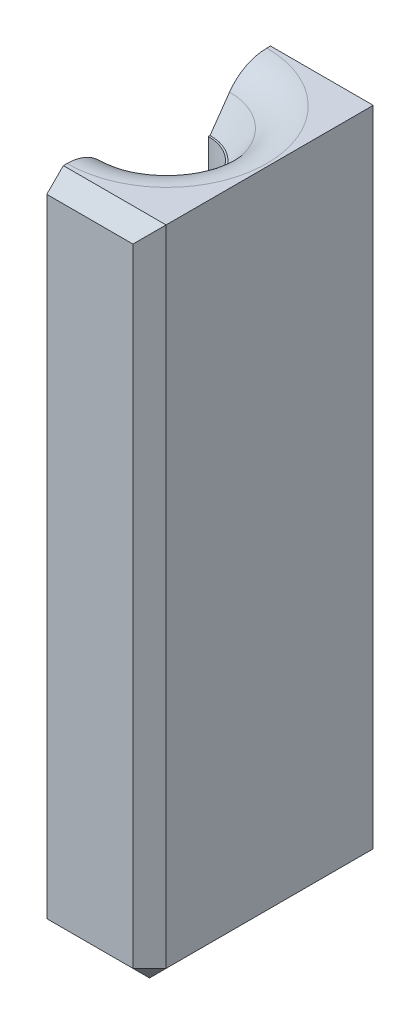
ISO-10303-21;
HEADER;
FILE_DESCRIPTION(('STEP AP214'),'2;1');
FILE_NAME('part.step','',(''),(''),'','','');
FILE_SCHEMA(('AUTOMOTIVE_DESIGN { 1 0 10303 214 1 1 1 1 }'));
ENDSEC;
DATA;
#1=APPLICATION_CONTEXT('core data for automotive mechanical design processes');
#2=APPLICATION_PROTOCOL_DEFINITION('international standard','automotive_design',2000,#1);
#3=PRODUCT_CONTEXT('',#1,'mechanical');
#4=PRODUCT('Part','Part','',(#3));
#5=PRODUCT_RELATED_PRODUCT_CATEGORY('part','',(#4));
#6=PRODUCT_DEFINITION_FORMATION('','',#4);
#7=PRODUCT_DEFINITION_CONTEXT('part definition',#1,'design');
#8=PRODUCT_DEFINITION('design','',#6,#7);
#9=PRODUCT_DEFINITION_SHAPE('','',#8);
#10=(LENGTH_UNIT() NAMED_UNIT(*) SI_UNIT(.MILLI.,.METRE.));
#11=(NAMED_UNIT(*) PLANE_ANGLE_UNIT() SI_UNIT($,.RADIAN.));
#12=(NAMED_UNIT(*) SI_UNIT($,.STERADIAN.) SOLID_ANGLE_UNIT());
#13=UNCERTAINTY_MEASURE_WITH_UNIT(LENGTH_MEASURE(1.E-05),#10,'distance_accuracy_value','');
#14=(GEOMETRIC_REPRESENTATION_CONTEXT(3) GLOBAL_UNCERTAINTY_ASSIGNED_CONTEXT((#13)) GLOBAL_UNIT_ASSIGNED_CONTEXT((#10,
#11,#12)) REPRESENTATION_CONTEXT('',''));
#15=CARTESIAN_POINT('',(0.,0.,0.));
#16=DIRECTION('',(0.,0.,1.));
#17=DIRECTION('',(1.,0.,0.));
#18=AXIS2_PLACEMENT_3D('',#15,#16,#17);
#19=CARTESIAN_POINT('',(30.,0.,0.));
#20=DIRECTION('',(-1.,0.,0.));
#21=DIRECTION('',(0.,0.,1.));
#22=AXIS2_PLACEMENT_3D('',#19,#20,#21);
#23=PLANE('',#22);
#24=CARTESIAN_POINT('',(30.,18.,-4.));
#25=DIRECTION('',(-1.,0.,0.));
#26=DIRECTION('',(0.,0.,1.));
#27=AXIS2_PLACEMENT_3D('',#24,#25,#26);
#28=CIRCLE('',#27,2.575);
#29=CARTESIAN_POINT('',(30.,18.,-1.425));
#30=VERTEX_POINT('',#29);
#31=EDGE_CURVE('E329',#30,#30,#28,.T.);
#32=ORIENTED_EDGE('',*,*,#31,.F.);
#33=EDGE_LOOP('',(#32));
#34=FACE_BOUND('',#33,.T.);
#35=CARTESIAN_POINT('',(30.,18.,-26.));
#36=DIRECTION('',(-1.,0.,0.));
#37=DIRECTION('',(0.,0.,1.));
#38=AXIS2_PLACEMENT_3D('',#35,#36,#37);
#39=CIRCLE('',#38,2.575);
#40=CARTESIAN_POINT('',(30.,18.,-23.425));
#41=VERTEX_POINT('',#40);
#42=EDGE_CURVE('E338',#41,#41,#39,.T.);
#43=ORIENTED_EDGE('',*,*,#42,.F.);
#44=EDGE_LOOP('',(#43));
#45=FACE_BOUND('',#44,.T.);
#46=CARTESIAN_POINT('',(30.,64.5,-26.));
#47=DIRECTION('',(-1.,0.,0.));
#48=DIRECTION('',(0.,0.,1.));
#49=AXIS2_PLACEMENT_3D('',#46,#47,#48);
#50=CIRCLE('',#49,2.575);
#51=CARTESIAN_POINT('',(30.,64.5,-23.425));
#52=VERTEX_POINT('',#51);
#53=EDGE_CURVE('E556',#52,#52,#50,.T.);
#54=ORIENTED_EDGE('',*,*,#53,.F.);
#55=EDGE_LOOP('',(#54));
#56=FACE_BOUND('',#55,.T.);
#57=CARTESIAN_POINT('',(30.,64.5,-4.));
#58=DIRECTION('',(-1.,0.,0.));
#59=DIRECTION('',(0.,0.,1.));
#60=AXIS2_PLACEMENT_3D('',#57,#58,#59);
#61=CIRCLE('',#60,2.575);
#62=CARTESIAN_POINT('',(30.,64.5,-1.42500000000001));
#63=VERTEX_POINT('',#62);
#64=EDGE_CURVE('E344',#63,#63,#61,.T.);
#65=ORIENTED_EDGE('',*,*,#64,.F.);
#66=EDGE_LOOP('',(#65));
#67=FACE_BOUND('',#66,.T.);
#68=DIRECTION('',(0.,1.,0.));
#69=VECTOR('',#68,1.);
#70=CARTESIAN_POINT('',(30.,0.,-0.5));
#71=LINE('',#70,#69);
#72=CARTESIAN_POINT('',(30.,6.28575422534895,-0.5));
#73=VERTEX_POINT('',#72);
#74=CARTESIAN_POINT('',(30.,82.,-0.5));
#75=VERTEX_POINT('',#74);
#76=EDGE_CURVE('E236',#73,#75,#71,.T.);
#77=ORIENTED_EDGE('',*,*,#76,.T.);
#78=DIRECTION('',(0.,0.707106781186546,-0.707106781186549));
#79=VECTOR('',#78,1.);
#80=CARTESIAN_POINT('',(30.,40.7500000000001,40.75));
#81=LINE('',#80,#79);
#82=CARTESIAN_POINT('',(30.,84.,-2.50000000000001));
#83=VERTEX_POINT('',#82);
#84=EDGE_CURVE('E286',#75,#83,#81,.T.);
#85=ORIENTED_EDGE('',*,*,#84,.T.);
#86=DIRECTION('',(0.,0.,-1.));
#87=VECTOR('',#86,1.);
#88=CARTESIAN_POINT('',(30.,84.,0.));
#89=LINE('',#88,#87);
#90=CARTESIAN_POINT('',(29.9999999999994,84.,-2.93688122196542));
#91=VERTEX_POINT('',#90);
#92=EDGE_CURVE('E380',#83,#91,#89,.T.);
#93=ORIENTED_EDGE('',*,*,#92,.T.);
#94=CARTESIAN_POINT('',(29.9999999999994,78.5,-2.93688122196542));
#95=DIRECTION('',(-1.,0.,0.));
#96=DIRECTION('',(0.,0.,1.));
#97=AXIS2_PLACEMENT_3D('',#94,#95,#96);
#98=CIRCLE('',#97,5.5);
#99=CARTESIAN_POINT('',(29.9999999999994,81.6546703999308,-7.44221746555486));
#100=VERTEX_POINT('',#99);
#101=EDGE_CURVE('E357',#100,#91,#98,.F.);
#102=ORIENTED_EDGE('',*,*,#101,.F.);
#103=DIRECTION('',(0.,0.819152044288991,0.573576436351047));
#104=VECTOR('',#103,1.);
#105=CARTESIAN_POINT('',(30.,70.8610383379726,-15.));
#106=LINE('',#105,#104);
#107=CARTESIAN_POINT('',(29.9999999999994,78.3,-9.79118296779536));
#108=VERTEX_POINT('',#107);
#109=EDGE_CURVE('E234',#100,#108,#106,.F.);
#110=ORIENTED_EDGE('',*,*,#109,.T.);
#111=DIRECTION('',(0.,0.,1.));
#112=VECTOR('',#111,1.);
#113=CARTESIAN_POINT('',(29.9999999999994,78.3,-15.));
#114=LINE('',#113,#112);
#115=CARTESIAN_POINT('',(29.9999999999994,78.3,-10.));
#116=VERTEX_POINT('',#115);
#117=EDGE_CURVE('E362',#116,#108,#114,.T.);
#118=ORIENTED_EDGE('',*,*,#117,.F.);
#119=DIRECTION('',(0.,1.,0.));
#120=VECTOR('',#119,1.);
#121=CARTESIAN_POINT('',(30.,0.,-10.));
#122=LINE('',#121,#120);
#123=CARTESIAN_POINT('',(30.,72.8279687630189,-10.));
#124=VERTEX_POINT('',#123);
#125=EDGE_CURVE('E368',#116,#124,#122,.F.);
#126=ORIENTED_EDGE('',*,*,#125,.T.);
#127=DIRECTION('',(0.,0.969140628666556,-0.246508502627785));
#128=VECTOR('',#127,1.);
#129=CARTESIAN_POINT('',(30.,92.4853156361592,-15.));
#130=LINE('',#129,#128);
#131=CARTESIAN_POINT('',(30.,57.5499259961936,-6.11391026840425));
#132=VERTEX_POINT('',#131);
#133=EDGE_CURVE('E413',#124,#132,#130,.F.);
#134=ORIENTED_EDGE('',*,*,#133,.T.);
#135=DIRECTION('',(0.,0.811788056770281,0.583952182019325));
#136=VECTOR('',#135,1.);
#137=CARTESIAN_POINT('',(30.,45.1968228867001,-15.));
#138=LINE('',#137,#136);
#139=CARTESIAN_POINT('',(30.,53.4020041055008,-9.09767926908721));
#140=VERTEX_POINT('',#139);
#141=EDGE_CURVE('E416',#132,#140,#138,.F.);
#142=ORIENTED_EDGE('',*,*,#141,.T.);
#143=DIRECTION('',(0.,0.,-1.));
#144=VECTOR('',#143,1.);
#145=CARTESIAN_POINT('',(30.,53.4020041055008,-24.9411461228427));
#146=LINE('',#145,#144);
#147=CARTESIAN_POINT('',(30.,53.4020041055008,-10.));
#148=VERTEX_POINT('',#147);
#149=EDGE_CURVE('E406',#140,#148,#146,.T.);
#150=ORIENTED_EDGE('',*,*,#149,.T.);
#151=DIRECTION('',(0.,1.,0.));
#152=VECTOR('',#151,1.);
#153=CARTESIAN_POINT('',(30.,0.,-10.));
#154=LINE('',#153,#152);
#155=CARTESIAN_POINT('',(30.,34.4020041055008,-10.));
#156=VERTEX_POINT('',#155);
#157=EDGE_CURVE('E400',#148,#156,#154,.F.);
#158=ORIENTED_EDGE('',*,*,#157,.T.);
#159=DIRECTION('',(0.,0.,1.));
#160=VECTOR('',#159,1.);
#161=CARTESIAN_POINT('',(30.,34.4020041055008,-24.9411461228427));
#162=LINE('',#161,#160);
#163=CARTESIAN_POINT('',(30.,34.4020041055008,-9.09767926908721));
#164=VERTEX_POINT('',#163);
#165=EDGE_CURVE('E385',#156,#164,#162,.T.);
#166=ORIENTED_EDGE('',*,*,#165,.T.);
#167=DIRECTION('',(0.,0.811788056770281,-0.583952182019325));
#168=VECTOR('',#167,1.);
#169=CARTESIAN_POINT('',(30.,42.6071853243014,-15.));
#170=LINE('',#169,#168);
#171=CARTESIAN_POINT('',(30.,30.2540822148079,-6.11391026840424));
#172=VERTEX_POINT('',#171);
#173=EDGE_CURVE('E391',#164,#172,#170,.F.);
#174=ORIENTED_EDGE('',*,*,#173,.T.);
#175=DIRECTION('',(0.,0.969140628666556,0.246508502627785));
#176=VECTOR('',#175,1.);
#177=CARTESIAN_POINT('',(30.,-4.6813074251577,-15.));
#178=LINE('',#177,#176);
#179=CARTESIAN_POINT('',(30.,14.9760394479826,-10.));
#180=VERTEX_POINT('',#179);
#181=EDGE_CURVE('E394',#172,#180,#178,.F.);
#182=ORIENTED_EDGE('',*,*,#181,.T.);
#183=DIRECTION('',(0.,1.,0.));
#184=VECTOR('',#183,1.);
#185=CARTESIAN_POINT('',(30.,0.,-10.));
#186=LINE('',#185,#184);
#187=CARTESIAN_POINT('',(30.,11.,-10.));
#188=VERTEX_POINT('',#187);
#189=EDGE_CURVE('E227',#180,#188,#186,.F.);
#190=ORIENTED_EDGE('',*,*,#189,.T.);
#191=DIRECTION('',(0.,0.,-1.));
#192=VECTOR('',#191,1.);
#193=CARTESIAN_POINT('',(30.,11.,-15.));
#194=LINE('',#193,#192);
#195=CARTESIAN_POINT('',(30.,11.,-11.45));
#196=VERTEX_POINT('',#195);
#197=EDGE_CURVE('E422',#188,#196,#194,.T.);
#198=ORIENTED_EDGE('',*,*,#197,.T.);
#199=DIRECTION('',(0.,0.707106781186544,0.707106781186551));
#200=VECTOR('',#199,1.);
#201=CARTESIAN_POINT('',(30.,7.45000000000003,-15.));
#202=LINE('',#201,#200);
#203=CARTESIAN_POINT('',(30.,10.6,-11.85));
#204=VERTEX_POINT('',#203);
#205=EDGE_CURVE('E226',#204,#196,#202,.T.);
#206=ORIENTED_EDGE('',*,*,#205,.F.);
#207=DIRECTION('',(0.,-1.,0.));
#208=VECTOR('',#207,1.);
#209=CARTESIAN_POINT('',(30.,11.,-11.85));
#210=LINE('',#209,#208);
#211=CARTESIAN_POINT('',(30.,6.28575422534894,-11.85));
#212=VERTEX_POINT('',#211);
#213=EDGE_CURVE('E212',#204,#212,#210,.T.);
#214=ORIENTED_EDGE('',*,*,#213,.T.);
#215=DIRECTION('',(0.,0.,-1.));
#216=VECTOR('',#215,1.);
#217=CARTESIAN_POINT('',(30.,6.28575422534894,0.));
#218=LINE('',#217,#216);
#219=CARTESIAN_POINT('',(30.,6.28575422534894,-18.15));
#220=VERTEX_POINT('',#219);
#221=EDGE_CURVE('E224',#212,#220,#218,.T.);
#222=ORIENTED_EDGE('',*,*,#221,.T.);
#223=DIRECTION('',(0.,-1.,0.));
#224=VECTOR('',#223,1.);
#225=CARTESIAN_POINT('',(30.,11.,-18.15));
#226=LINE('',#225,#224);
#227=CARTESIAN_POINT('',(30.,10.6,-18.15));
#228=VERTEX_POINT('',#227);
#229=EDGE_CURVE('E215',#220,#228,#226,.F.);
#230=ORIENTED_EDGE('',*,*,#229,.T.);
#231=DIRECTION('',(0.,-0.707106781186544,0.707106781186551));
#232=VECTOR('',#231,1.);
#233=CARTESIAN_POINT('',(30.,7.45000000000003,-15.));
#234=LINE('',#233,#232);
#235=CARTESIAN_POINT('',(30.,11.,-18.55));
#236=VERTEX_POINT('',#235);
#237=EDGE_CURVE('E365',#236,#228,#234,.T.);
#238=ORIENTED_EDGE('',*,*,#237,.F.);
#239=CARTESIAN_POINT('',(30.,11.,-20.));
#240=VERTEX_POINT('',#239);
#241=EDGE_CURVE('E423',#236,#240,#194,.T.);
#242=ORIENTED_EDGE('',*,*,#241,.T.);
#243=DIRECTION('',(0.,1.,0.));
#244=VECTOR('',#243,1.);
#245=CARTESIAN_POINT('',(30.,0.,-20.));
#246=LINE('',#245,#244);
#247=CARTESIAN_POINT('',(30.,14.9760394479826,-20.));
#248=VERTEX_POINT('',#247);
#249=EDGE_CURVE('E377',#240,#248,#246,.T.);
#250=ORIENTED_EDGE('',*,*,#249,.T.);
#251=DIRECTION('',(0.,-0.969140628666556,0.246508502627785));
#252=VECTOR('',#251,1.);
#253=CARTESIAN_POINT('',(30.,-4.6813074251577,-15.));
#254=LINE('',#253,#252);
#255=CARTESIAN_POINT('',(30.,30.2540822148079,-23.8860897315958));
#256=VERTEX_POINT('',#255);
#257=EDGE_CURVE('E397',#248,#256,#254,.F.);
#258=ORIENTED_EDGE('',*,*,#257,.T.);
#259=DIRECTION('',(0.,-0.811788056770281,-0.583952182019325));
#260=VECTOR('',#259,1.);
#261=CARTESIAN_POINT('',(30.,42.6071853243014,-15.));
#262=LINE('',#261,#260);
#263=CARTESIAN_POINT('',(30.,34.4020041055008,-20.9023207309128));
#264=VERTEX_POINT('',#263);
#265=EDGE_CURVE('E388',#256,#264,#262,.F.);
#266=ORIENTED_EDGE('',*,*,#265,.T.);
#267=CARTESIAN_POINT('',(30.,34.4020041055008,-20.));
#268=VERTEX_POINT('',#267);
#269=EDGE_CURVE('E384',#264,#268,#162,.T.);
#270=ORIENTED_EDGE('',*,*,#269,.T.);
#271=DIRECTION('',(0.,1.,0.));
#272=VECTOR('',#271,1.);
#273=CARTESIAN_POINT('',(30.,0.,-20.));
#274=LINE('',#273,#272);
#275=CARTESIAN_POINT('',(30.,53.4020041055008,-20.));
#276=VERTEX_POINT('',#275);
#277=EDGE_CURVE('E403',#268,#276,#274,.T.);
#278=ORIENTED_EDGE('',*,*,#277,.T.);
#279=CARTESIAN_POINT('',(30.,53.4020041055008,-20.9023207309128));
#280=VERTEX_POINT('',#279);
#281=EDGE_CURVE('E407',#276,#280,#146,.T.);
#282=ORIENTED_EDGE('',*,*,#281,.T.);
#283=DIRECTION('',(0.,-0.811788056770281,0.583952182019325));
#284=VECTOR('',#283,1.);
#285=CARTESIAN_POINT('',(30.,45.1968228867001,-15.));
#286=LINE('',#285,#284);
#287=CARTESIAN_POINT('',(30.,57.5499259961936,-23.8860897315957));
#288=VERTEX_POINT('',#287);
#289=EDGE_CURVE('E419',#280,#288,#286,.F.);
#290=ORIENTED_EDGE('',*,*,#289,.T.);
#291=DIRECTION('',(0.,-0.969140628666556,-0.246508502627785));
#292=VECTOR('',#291,1.);
#293=CARTESIAN_POINT('',(30.,92.4853156361592,-15.));
#294=LINE('',#293,#292);
#295=CARTESIAN_POINT('',(30.,72.8279687630189,-20.));
#296=VERTEX_POINT('',#295);
#297=EDGE_CURVE('E410',#288,#296,#294,.F.);
#298=ORIENTED_EDGE('',*,*,#297,.T.);
#299=DIRECTION('',(0.,1.,0.));
#300=VECTOR('',#299,1.);
#301=CARTESIAN_POINT('',(30.,0.,-20.));
#302=LINE('',#301,#300);
#303=CARTESIAN_POINT('',(29.9999999999994,78.3,-20.));
#304=VERTEX_POINT('',#303);
#305=EDGE_CURVE('E371',#296,#304,#302,.T.);
#306=ORIENTED_EDGE('',*,*,#305,.T.);
#307=CARTESIAN_POINT('',(30.,78.3,-20.2088170322047));
#308=VERTEX_POINT('',#307);
#309=EDGE_CURVE('E363',#308,#304,#114,.T.);
#310=ORIENTED_EDGE('',*,*,#309,.F.);
#311=DIRECTION('',(0.,-0.819152044288991,0.573576436351047));
#312=VECTOR('',#311,1.);
#313=CARTESIAN_POINT('',(30.,70.8610383379726,-15.));
#314=LINE('',#313,#312);
#315=CARTESIAN_POINT('',(29.9999999999994,81.6546703999308,-22.5577825344452));
#316=VERTEX_POINT('',#315);
#317=EDGE_CURVE('E230',#308,#316,#314,.F.);
#318=ORIENTED_EDGE('',*,*,#317,.T.);
#319=CARTESIAN_POINT('',(29.9999999999994,78.5,-27.0631187780346));
#320=DIRECTION('',(-1.,0.,0.));
#321=DIRECTION('',(0.,0.,1.));
#322=AXIS2_PLACEMENT_3D('',#319,#320,#321);
#323=CIRCLE('',#322,5.5);
#324=CARTESIAN_POINT('',(29.9999999999994,84.,-27.0631187780346));
#325=VERTEX_POINT('',#324);
#326=EDGE_CURVE('E360',#325,#316,#323,.F.);
#327=ORIENTED_EDGE('',*,*,#326,.F.);
#328=CARTESIAN_POINT('',(30.,84.,-27.5));
#329=VERTEX_POINT('',#328);
#330=EDGE_CURVE('E381',#325,#329,#89,.T.);
#331=ORIENTED_EDGE('',*,*,#330,.T.);
#332=DIRECTION('',(0.,0.707106781186546,0.707106781186549));
#333=VECTOR('',#332,1.);
#334=CARTESIAN_POINT('',(30.,55.7500000000001,-55.75));
#335=LINE('',#334,#333);
#336=CARTESIAN_POINT('',(30.,82.,-29.5));
#337=VERTEX_POINT('',#336);
#338=EDGE_CURVE('E280',#329,#337,#335,.F.);
#339=ORIENTED_EDGE('',*,*,#338,.T.);
#340=DIRECTION('',(0.,1.,0.));
#341=VECTOR('',#340,1.);
#342=CARTESIAN_POINT('',(30.,0.,-29.5));
#343=LINE('',#342,#341);
#344=CARTESIAN_POINT('',(30.,6.28575422534894,-29.5));
#345=VERTEX_POINT('',#344);
#346=EDGE_CURVE('E231',#345,#337,#343,.T.);
#347=ORIENTED_EDGE('',*,*,#346,.F.);
#348=DIRECTION('',(0.,-0.707106781186546,0.707106781186549));
#349=VECTOR('',#348,1.);
#350=CARTESIAN_POINT('',(30.,-11.6071228873255,-11.6071228873255));
#351=LINE('',#350,#349);
#352=CARTESIAN_POINT('',(30.,4.28575422534894,-27.5));
#353=VERTEX_POINT('',#352);
#354=EDGE_CURVE('E282',#345,#353,#351,.T.);
#355=ORIENTED_EDGE('',*,*,#354,.T.);
#356=DIRECTION('',(0.,0.,-1.));
#357=VECTOR('',#356,1.);
#358=CARTESIAN_POINT('',(30.,4.28575422534894,0.));
#359=LINE('',#358,#357);
#360=CARTESIAN_POINT('',(30.,4.28575422534894,-2.5));
#361=VERTEX_POINT('',#360);
#362=EDGE_CURVE('E244',#361,#353,#359,.T.);
#363=ORIENTED_EDGE('',*,*,#362,.F.);
#364=DIRECTION('',(0.,-0.707106781186549,-0.707106781186546));
#365=VECTOR('',#364,1.);
#366=CARTESIAN_POINT('',(30.,3.39287711267446,-3.39287711267447));
#367=LINE('',#366,#365);
#368=EDGE_CURVE('E284',#361,#73,#367,.F.);
#369=ORIENTED_EDGE('',*,*,#368,.T.);
#370=EDGE_LOOP('',(#77,#85,#93,#102,#110,#118,#126,#134,#142,#150,#158,#166,#174,#182,#190,#198,
#206,#214,#222,#230,#238,#242,#250,#258,#266,#270,#278,#282,#290,#298,#306,#310,#318,#327,#331,
#339,#347,#355,#363,#369));
#371=FACE_BOUND('',#370,.T.);
#372=ADVANCED_FACE('F40',(#34,#45,#56,#67,#371),#23,.T.);
#373=CARTESIAN_POINT('',(15.,4.28575422534894,0.));
#374=DIRECTION('',(0.,-1.,0.));
#375=DIRECTION('',(0.,0.,-1.));
#376=AXIS2_PLACEMENT_3D('',#373,#374,#375);
#377=PLANE('',#376);
#378=DIRECTION('',(0.,0.,1.));
#379=VECTOR('',#378,1.);
#380=CARTESIAN_POINT('',(40.4,4.28575422534894,-0.5));
#381=LINE('',#380,#379);
#382=CARTESIAN_POINT('',(40.4,4.28575422534894,-27.5));
#383=VERTEX_POINT('',#382);
#384=CARTESIAN_POINT('',(40.4,4.28575422534894,-2.5));
#385=VERTEX_POINT('',#384);
#386=EDGE_CURVE('E300',#383,#385,#381,.T.);
#387=ORIENTED_EDGE('',*,*,#386,.T.);
#388=DIRECTION('',(-1.,0.,0.));
#389=VECTOR('',#388,1.);
#390=CARTESIAN_POINT('',(15.,4.28575422534894,-2.5));
#391=LINE('',#390,#389);
#392=EDGE_CURVE('E302',#385,#361,#391,.T.);
#393=ORIENTED_EDGE('',*,*,#392,.T.);
#394=ORIENTED_EDGE('',*,*,#362,.T.);
#395=DIRECTION('',(1.,0.,0.));
#396=VECTOR('',#395,1.);
#397=CARTESIAN_POINT('',(42.4,4.28575422534894,-27.5));
#398=LINE('',#397,#396);
#399=EDGE_CURVE('E298',#353,#383,#398,.T.);
#400=ORIENTED_EDGE('',*,*,#399,.T.);
#401=EDGE_LOOP('',(#387,#393,#394,#400));
#402=FACE_BOUND('',#401,.T.);
#403=ADVANCED_FACE('F499',(#402),#377,.T.);
#404=CARTESIAN_POINT('',(30.,34.4020041055008,-24.9411461228427));
#405=DIRECTION('',(0.,1.,0.));
#406=DIRECTION('',(0.,0.,-1.));
#407=AXIS2_PLACEMENT_3D('',#404,#405,#406);
#408=PLANE('',#407);
#409=ORIENTED_EDGE('',*,*,#269,.F.);
#410=CARTESIAN_POINT('',(30.,34.4020041055008,-15.));
#411=DIRECTION('',(0.,-1.,0.));
#412=DIRECTION('',(0.,0.,-1.));
#413=AXIS2_PLACEMENT_3D('',#410,#411,#412);
#414=CIRCLE('',#413,5.90232073091279);
#415=EDGE_CURVE('E268',#264,#164,#414,.T.);
#416=ORIENTED_EDGE('',*,*,#415,.T.);
#417=ORIENTED_EDGE('',*,*,#165,.F.);
#418=CARTESIAN_POINT('',(30.,34.4020041055008,-15.));
#419=DIRECTION('',(0.,1.,0.));
#420=DIRECTION('',(0.,0.,1.));
#421=AXIS2_PLACEMENT_3D('',#418,#419,#420);
#422=CIRCLE('',#421,5.);
#423=EDGE_CURVE('E258',#268,#156,#422,.F.);
#424=ORIENTED_EDGE('',*,*,#423,.F.);
#425=EDGE_LOOP('',(#409,#416,#417,#424));
#426=FACE_BOUND('',#425,.T.);
#427=ADVANCED_FACE('F465',(#426),#408,.F.);
#428=CARTESIAN_POINT('',(30.,0.,-15.));
#429=DIRECTION('',(0.,1.,0.));
#430=DIRECTION('',(0.,0.,1.));
#431=AXIS2_PLACEMENT_3D('',#428,#429,#430);
#432=CYLINDRICAL_SURFACE('',#431,5.);
#433=ORIENTED_EDGE('',*,*,#157,.F.);
#434=CARTESIAN_POINT('',(30.,53.4020041055008,-15.));
#435=DIRECTION('',(0.,-1.,0.));
#436=DIRECTION('',(0.,0.,-1.));
#437=AXIS2_PLACEMENT_3D('',#434,#435,#436);
#438=CIRCLE('',#437,5.);
#439=EDGE_CURVE('E254',#148,#276,#438,.F.);
#440=ORIENTED_EDGE('',*,*,#439,.T.);
#441=ORIENTED_EDGE('',*,*,#277,.F.);
#442=ORIENTED_EDGE('',*,*,#423,.T.);
#443=EDGE_LOOP('',(#433,#440,#441,#442));
#444=FACE_BOUND('',#443,.T.);
#445=ADVANCED_FACE('F460',(#444),#432,.F.);
#446=ORIENTED_EDGE('',*,*,#125,.F.);
#447=CARTESIAN_POINT('',(30.,78.3,-15.));
#448=DIRECTION('',(0.,1.,0.));
#449=DIRECTION('',(0.,0.,1.));
#450=AXIS2_PLACEMENT_3D('',#447,#448,#449);
#451=CIRCLE('',#450,5.);
#452=EDGE_CURVE('E270',#304,#116,#451,.F.);
#453=ORIENTED_EDGE('',*,*,#452,.F.);
#454=ORIENTED_EDGE('',*,*,#305,.F.);
#455=CARTESIAN_POINT('',(30.,72.8279687630189,-15.));
#456=DIRECTION('',(0.,-1.,0.));
#457=DIRECTION('',(0.,0.,-1.));
#458=AXIS2_PLACEMENT_3D('',#455,#456,#457);
#459=CIRCLE('',#458,5.);
#460=EDGE_CURVE('E256',#296,#124,#459,.T.);
#461=ORIENTED_EDGE('',*,*,#460,.T.);
#462=EDGE_LOOP('',(#446,#453,#454,#461));
#463=FACE_BOUND('',#462,.T.);
#464=ADVANCED_FACE('F443',(#463),#432,.F.);
#465=CARTESIAN_POINT('',(29.9999999999994,78.3,-15.));
#466=DIRECTION('',(0.,1.,0.));
#467=DIRECTION('',(0.,0.,1.));
#468=AXIS2_PLACEMENT_3D('',#465,#466,#467);
#469=PLANE('',#468);
#470=CARTESIAN_POINT('',(29.9999999999994,78.3,-15.));
#471=DIRECTION('',(0.,1.,0.));
#472=DIRECTION('',(0.,0.,1.));
#473=AXIS2_PLACEMENT_3D('',#470,#471,#472);
#474=CIRCLE('',#473,5.20881703220465);
#475=EDGE_CURVE('E220',#108,#308,#474,.T.);
#476=ORIENTED_EDGE('',*,*,#475,.T.);
#477=ORIENTED_EDGE('',*,*,#309,.T.);
#478=ORIENTED_EDGE('',*,*,#452,.T.);
#479=ORIENTED_EDGE('',*,*,#117,.T.);
#480=EDGE_LOOP('',(#476,#477,#478,#479));
#481=FACE_BOUND('',#480,.T.);
#482=ADVANCED_FACE('F441',(#481),#469,.T.);
#483=CARTESIAN_POINT('',(29.9999999999994,84.,-15.));
#484=DIRECTION('',(0.,1.,0.));
#485=DIRECTION('',(0.,0.,1.));
#486=AXIS2_PLACEMENT_3D('',#483,#484,#485);
#487=CONICAL_SURFACE('',#486,9.2,0.610865238198017);
#488=ORIENTED_EDGE('',*,*,#109,.F.);
#489=CARTESIAN_POINT('',(29.9999999999994,81.6546703999308,-15.));
#490=DIRECTION('',(0.,-1.,0.));
#491=DIRECTION('',(0.,0.,-1.));
#492=AXIS2_PLACEMENT_3D('',#489,#490,#491);
#493=CIRCLE('',#492,7.55778253444515);
#494=EDGE_CURVE('E243',#100,#316,#493,.F.);
#495=ORIENTED_EDGE('',*,*,#494,.T.);
#496=ORIENTED_EDGE('',*,*,#317,.F.);
#497=ORIENTED_EDGE('',*,*,#475,.F.);
#498=EDGE_LOOP('',(#488,#495,#496,#497));
#499=FACE_BOUND('',#498,.T.);
#500=ADVANCED_FACE('F431',(#499),#487,.F.);
#501=CARTESIAN_POINT('',(15.,84.,0.));
#502=DIRECTION('',(0.,-1.,0.));
#503=DIRECTION('',(0.,0.,-1.));
#504=AXIS2_PLACEMENT_3D('',#501,#502,#503);
#505=PLANE('',#504);
#506=ORIENTED_EDGE('',*,*,#92,.F.);
#507=DIRECTION('',(1.,0.,0.));
#508=VECTOR('',#507,1.);
#509=CARTESIAN_POINT('',(42.4,84.,-2.50000000000001));
#510=LINE('',#509,#508);
#511=CARTESIAN_POINT('',(42.4,84.,-2.5));
#512=VERTEX_POINT('',#511);
#513=EDGE_CURVE('E290',#83,#512,#510,.T.);
#514=ORIENTED_EDGE('',*,*,#513,.T.);
#515=DIRECTION('',(0.,0.,1.));
#516=VECTOR('',#515,1.);
#517=CARTESIAN_POINT('',(42.4,84.,0.));
#518=LINE('',#517,#516);
#519=CARTESIAN_POINT('',(42.4,84.,-27.5));
#520=VERTEX_POINT('',#519);
#521=EDGE_CURVE('E351',#520,#512,#518,.T.);
#522=ORIENTED_EDGE('',*,*,#521,.F.);
#523=DIRECTION('',(-1.,0.,0.));
#524=VECTOR('',#523,1.);
#525=CARTESIAN_POINT('',(15.,84.,-27.5));
#526=LINE('',#525,#524);
#527=EDGE_CURVE('E288',#520,#329,#526,.T.);
#528=ORIENTED_EDGE('',*,*,#527,.T.);
#529=ORIENTED_EDGE('',*,*,#330,.F.);
#530=CARTESIAN_POINT('',(29.9999999999994,84.,-15.));
#531=DIRECTION('',(0.,-1.,0.));
#532=DIRECTION('',(0.,0.,-1.));
#533=AXIS2_PLACEMENT_3D('',#530,#531,#532);
#534=CIRCLE('',#533,12.0631187780346);
#535=EDGE_CURVE('E240',#325,#91,#534,.T.);
#536=ORIENTED_EDGE('',*,*,#535,.T.);
#537=EDGE_LOOP('',(#506,#514,#522,#528,#529,#536));
#538=FACE_BOUND('',#537,.T.);
#539=ADVANCED_FACE('F752',(#538),#505,.F.);
#540=CARTESIAN_POINT('',(29.9999999999994,78.5,-15.));
#541=DIRECTION('',(0.,-1.,0.));
#542=DIRECTION('',(0.,0.,-1.));
#543=AXIS2_PLACEMENT_3D('',#540,#541,#542);
#544=TOROIDAL_SURFACE('',#543,12.0631187780346,5.5);
#545=ORIENTED_EDGE('',*,*,#535,.F.);
#546=ORIENTED_EDGE('',*,*,#326,.T.);
#547=ORIENTED_EDGE('',*,*,#494,.F.);
#548=ORIENTED_EDGE('',*,*,#101,.T.);
#549=EDGE_LOOP('',(#545,#546,#547,#548));
#550=FACE_BOUND('',#549,.T.);
#551=ADVANCED_FACE('F435',(#550),#544,.T.);
#552=CARTESIAN_POINT('',(30.,53.4020041055008,-24.9411461228427));
#553=DIRECTION('',(0.,-1.,0.));
#554=DIRECTION('',(0.,0.,-1.));
#555=AXIS2_PLACEMENT_3D('',#552,#553,#554);
#556=PLANE('',#555);
#557=ORIENTED_EDGE('',*,*,#149,.F.);
#558=CARTESIAN_POINT('',(30.,53.4020041055008,-15.));
#559=DIRECTION('',(0.,-1.,0.));
#560=DIRECTION('',(0.,0.,-1.));
#561=AXIS2_PLACEMENT_3D('',#558,#559,#560);
#562=CIRCLE('',#561,5.90232073091279);
#563=EDGE_CURVE('E264',#280,#140,#562,.T.);
#564=ORIENTED_EDGE('',*,*,#563,.F.);
#565=ORIENTED_EDGE('',*,*,#281,.F.);
#566=ORIENTED_EDGE('',*,*,#439,.F.);
#567=EDGE_LOOP('',(#557,#564,#565,#566));
#568=FACE_BOUND('',#567,.T.);
#569=ADVANCED_FACE('F456',(#568),#556,.F.);
#570=CARTESIAN_POINT('',(30.,53.4020041055008,-15.));
#571=DIRECTION('',(0.,-1.,0.));
#572=DIRECTION('',(0.,0.,-1.));
#573=AXIS2_PLACEMENT_3D('',#570,#571,#572);
#574=CONICAL_SURFACE('',#573,9.94114612284268,0.249075921515313);
#575=ORIENTED_EDGE('',*,*,#297,.F.);
#576=CARTESIAN_POINT('',(30.,57.5499259961936,-15.));
#577=DIRECTION('',(0.,1.,0.));
#578=DIRECTION('',(0.,0.,1.));
#579=AXIS2_PLACEMENT_3D('',#576,#577,#578);
#580=CIRCLE('',#579,8.88608973159575);
#581=EDGE_CURVE('E262',#132,#288,#580,.T.);
#582=ORIENTED_EDGE('',*,*,#581,.F.);
#583=ORIENTED_EDGE('',*,*,#133,.F.);
#584=ORIENTED_EDGE('',*,*,#460,.F.);
#585=EDGE_LOOP('',(#575,#582,#583,#584));
#586=FACE_BOUND('',#585,.T.);
#587=ADVANCED_FACE('F448',(#586),#574,.F.);
#588=CARTESIAN_POINT('',(30.,53.4020041055008,-15.));
#589=DIRECTION('',(0.,1.,0.));
#590=DIRECTION('',(0.,0.,1.));
#591=AXIS2_PLACEMENT_3D('',#588,#589,#590);
#592=CONICAL_SURFACE('',#591,5.90232073091279,0.623588704481849);
#593=ORIENTED_EDGE('',*,*,#141,.F.);
#594=ORIENTED_EDGE('',*,*,#581,.T.);
#595=ORIENTED_EDGE('',*,*,#289,.F.);
#596=ORIENTED_EDGE('',*,*,#563,.T.);
#597=EDGE_LOOP('',(#593,#594,#595,#596));
#598=FACE_BOUND('',#597,.T.);
#599=ADVANCED_FACE('F451',(#598),#592,.F.);
#600=ORIENTED_EDGE('',*,*,#189,.F.);
#601=CARTESIAN_POINT('',(30.,14.9760394479826,-15.));
#602=DIRECTION('',(0.,1.,0.));
#603=DIRECTION('',(0.,0.,1.));
#604=AXIS2_PLACEMENT_3D('',#601,#602,#603);
#605=CIRCLE('',#604,5.);
#606=EDGE_CURVE('E260',#180,#248,#605,.T.);
#607=ORIENTED_EDGE('',*,*,#606,.T.);
#608=ORIENTED_EDGE('',*,*,#249,.F.);
#609=CARTESIAN_POINT('',(30.,11.,-15.));
#610=DIRECTION('',(0.,-1.,0.));
#611=DIRECTION('',(0.,0.,-1.));
#612=AXIS2_PLACEMENT_3D('',#609,#610,#611);
#613=CIRCLE('',#612,5.);
#614=EDGE_CURVE('E252',#188,#240,#613,.F.);
#615=ORIENTED_EDGE('',*,*,#614,.F.);
#616=EDGE_LOOP('',(#600,#607,#608,#615));
#617=FACE_BOUND('',#616,.T.);
#618=ADVANCED_FACE('F484',(#617),#432,.F.);
#619=CARTESIAN_POINT('',(30.,11.,-15.));
#620=DIRECTION('',(0.,-1.,0.));
#621=DIRECTION('',(0.,0.,-1.));
#622=AXIS2_PLACEMENT_3D('',#619,#620,#621);
#623=PLANE('',#622);
#624=ORIENTED_EDGE('',*,*,#197,.F.);
#625=ORIENTED_EDGE('',*,*,#614,.T.);
#626=ORIENTED_EDGE('',*,*,#241,.F.);
#627=CARTESIAN_POINT('',(30.,11.,-15.));
#628=DIRECTION('',(0.,-1.,0.));
#629=DIRECTION('',(0.,0.,-1.));
#630=AXIS2_PLACEMENT_3D('',#627,#628,#629);
#631=CIRCLE('',#630,3.55000000000001);
#632=EDGE_CURVE('E247',#236,#196,#631,.T.);
#633=ORIENTED_EDGE('',*,*,#632,.T.);
#634=EDGE_LOOP('',(#624,#625,#626,#633));
#635=FACE_BOUND('',#634,.T.);
#636=ADVANCED_FACE('F478',(#635),#623,.F.);
#637=CARTESIAN_POINT('',(30.,11.,-15.));
#638=DIRECTION('',(0.,-1.,0.));
#639=DIRECTION('',(0.,0.,-1.));
#640=AXIS2_PLACEMENT_3D('',#637,#638,#639);
#641=CYLINDRICAL_SURFACE('',#640,3.15);
#642=ORIENTED_EDGE('',*,*,#229,.F.);
#643=CARTESIAN_POINT('',(30.,6.28575422534894,-15.));
#644=DIRECTION('',(0.,1.,0.));
#645=DIRECTION('',(0.,0.,1.));
#646=AXIS2_PLACEMENT_3D('',#643,#644,#645);
#647=CIRCLE('',#646,3.15);
#648=EDGE_CURVE('E208',#220,#212,#647,.F.);
#649=ORIENTED_EDGE('',*,*,#648,.T.);
#650=ORIENTED_EDGE('',*,*,#213,.F.);
#651=CARTESIAN_POINT('',(30.,10.6,-15.));
#652=DIRECTION('',(0.,-1.,0.));
#653=DIRECTION('',(0.,0.,-1.));
#654=AXIS2_PLACEMENT_3D('',#651,#652,#653);
#655=CIRCLE('',#654,3.15);
#656=EDGE_CURVE('E250',#204,#228,#655,.F.);
#657=ORIENTED_EDGE('',*,*,#656,.T.);
#658=EDGE_LOOP('',(#642,#649,#650,#657));
#659=FACE_BOUND('',#658,.T.);
#660=ADVANCED_FACE('F210',(#659),#641,.F.);
#661=CARTESIAN_POINT('',(15.,6.28575422534894,0.));
#662=DIRECTION('',(0.,-1.,0.));
#663=DIRECTION('',(0.,0.,-1.));
#664=AXIS2_PLACEMENT_3D('',#661,#662,#663);
#665=PLANE('',#664);
#666=ORIENTED_EDGE('',*,*,#221,.F.);
#667=ORIENTED_EDGE('',*,*,#648,.F.);
#668=EDGE_LOOP('',(#666,#667));
#669=FACE_BOUND('',#668,.T.);
#670=ADVANCED_FACE('F229',(#669),#665,.F.);
#671=CARTESIAN_POINT('',(30.,11.,-15.));
#672=DIRECTION('',(0.,1.,0.));
#673=DIRECTION('',(0.,0.,1.));
#674=AXIS2_PLACEMENT_3D('',#671,#672,#673);
#675=CONICAL_SURFACE('',#674,3.55000000000001,0.785398163397454);
#676=ORIENTED_EDGE('',*,*,#656,.F.);
#677=ORIENTED_EDGE('',*,*,#205,.T.);
#678=ORIENTED_EDGE('',*,*,#632,.F.);
#679=ORIENTED_EDGE('',*,*,#237,.T.);
#680=EDGE_LOOP('',(#676,#677,#678,#679));
#681=FACE_BOUND('',#680,.T.);
#682=ADVANCED_FACE('F483',(#681),#675,.F.);
#683=CARTESIAN_POINT('',(30.,34.4020041055008,-15.));
#684=DIRECTION('',(0.,-1.,0.));
#685=DIRECTION('',(0.,0.,1.));
#686=AXIS2_PLACEMENT_3D('',#683,#684,#685);
#687=CONICAL_SURFACE('',#686,5.90232073091279,0.623588704481849);
#688=ORIENTED_EDGE('',*,*,#265,.F.);
#689=CARTESIAN_POINT('',(30.,30.2540822148079,-15.));
#690=DIRECTION('',(0.,1.,0.));
#691=DIRECTION('',(0.,0.,1.));
#692=AXIS2_PLACEMENT_3D('',#689,#690,#691);
#693=CIRCLE('',#692,8.88608973159575);
#694=EDGE_CURVE('E266',#172,#256,#693,.T.);
#695=ORIENTED_EDGE('',*,*,#694,.F.);
#696=ORIENTED_EDGE('',*,*,#173,.F.);
#697=ORIENTED_EDGE('',*,*,#415,.F.);
#698=EDGE_LOOP('',(#688,#695,#696,#697));
#699=FACE_BOUND('',#698,.T.);
#700=ADVANCED_FACE('F470',(#699),#687,.F.);
#701=CARTESIAN_POINT('',(30.,34.4020041055008,-15.));
#702=DIRECTION('',(0.,1.,0.));
#703=DIRECTION('',(0.,0.,-1.));
#704=AXIS2_PLACEMENT_3D('',#701,#702,#703);
#705=CONICAL_SURFACE('',#704,9.94114612284268,0.249075921515313);
#706=ORIENTED_EDGE('',*,*,#181,.F.);
#707=ORIENTED_EDGE('',*,*,#694,.T.);
#708=ORIENTED_EDGE('',*,*,#257,.F.);
#709=ORIENTED_EDGE('',*,*,#606,.F.);
#710=EDGE_LOOP('',(#706,#707,#708,#709));
#711=FACE_BOUND('',#710,.T.);
#712=ADVANCED_FACE('F473',(#711),#705,.F.);
#713=CARTESIAN_POINT('',(42.4,4.28575422534894,0.));
#714=DIRECTION('',(-1.,0.,0.));
#715=DIRECTION('',(0.,0.,1.));
#716=AXIS2_PLACEMENT_3D('',#713,#714,#715);
#717=PLANE('',#716);
#718=ORIENTED_EDGE('',*,*,#521,.T.);
#719=DIRECTION('',(0.,-1.,0.));
#720=VECTOR('',#719,1.);
#721=CARTESIAN_POINT('',(42.4,4.28575422534894,-2.5));
#722=LINE('',#721,#720);
#723=CARTESIAN_POINT('',(42.4,6.28575422534894,-2.5));
#724=VERTEX_POINT('',#723);
#725=EDGE_CURVE('E296',#512,#724,#722,.T.);
#726=ORIENTED_EDGE('',*,*,#725,.T.);
#727=DIRECTION('',(0.,0.,-1.));
#728=VECTOR('',#727,1.);
#729=CARTESIAN_POINT('',(42.4,6.28575422534894,-29.5));
#730=LINE('',#729,#728);
#731=CARTESIAN_POINT('',(42.4,6.28575422534894,-27.5));
#732=VERTEX_POINT('',#731);
#733=EDGE_CURVE('E294',#724,#732,#730,.T.);
#734=ORIENTED_EDGE('',*,*,#733,.T.);
#735=DIRECTION('',(0.,1.,0.));
#736=VECTOR('',#735,1.);
#737=CARTESIAN_POINT('',(42.4,4.28575422534894,-27.5));
#738=LINE('',#737,#736);
#739=EDGE_CURVE('E292',#732,#520,#738,.T.);
#740=ORIENTED_EDGE('',*,*,#739,.T.);
#741=EDGE_LOOP('',(#718,#726,#734,#740));
#742=FACE_BOUND('',#741,.T.);
#743=ADVANCED_FACE('F509',(#742),#717,.F.);
#744=CARTESIAN_POINT('',(15.,4.28575422534894,-29.5));
#745=DIRECTION('',(0.,0.,1.));
#746=DIRECTION('',(1.,0.,0.));
#747=AXIS2_PLACEMENT_3D('',#744,#745,#746);
#748=PLANE('',#747);
#749=DIRECTION('',(0.,-1.,0.));
#750=VECTOR('',#749,1.);
#751=CARTESIAN_POINT('',(40.4,4.28575422534894,-29.5));
#752=LINE('',#751,#750);
#753=CARTESIAN_POINT('',(40.4,82.,-29.5));
#754=VERTEX_POINT('',#753);
#755=CARTESIAN_POINT('',(40.4,6.28575422534894,-29.5));
#756=VERTEX_POINT('',#755);
#757=EDGE_CURVE('E50',#754,#756,#752,.T.);
#758=ORIENTED_EDGE('',*,*,#757,.T.);
#759=DIRECTION('',(-1.,0.,0.));
#760=VECTOR('',#759,1.);
#761=CARTESIAN_POINT('',(30.,6.28575422534894,-29.5));
#762=LINE('',#761,#760);
#763=EDGE_CURVE('E11',#756,#345,#762,.T.);
#764=ORIENTED_EDGE('',*,*,#763,.T.);
#765=ORIENTED_EDGE('',*,*,#346,.T.);
#766=DIRECTION('',(1.,0.,0.));
#767=VECTOR('',#766,1.);
#768=CARTESIAN_POINT('',(15.,82.,-29.5));
#769=LINE('',#768,#767);
#770=EDGE_CURVE('E61',#337,#754,#769,.T.);
#771=ORIENTED_EDGE('',*,*,#770,.T.);
#772=EDGE_LOOP('',(#758,#764,#765,#771));
#773=FACE_BOUND('',#772,.T.);
#774=ADVANCED_FACE('F512',(#773),#748,.F.);
#775=CARTESIAN_POINT('',(15.,4.28575422534894,-0.5));
#776=DIRECTION('',(0.,0.,1.));
#777=DIRECTION('',(1.,0.,0.));
#778=AXIS2_PLACEMENT_3D('',#775,#776,#777);
#779=PLANE('',#778);
#780=DIRECTION('',(0.,1.,0.));
#781=VECTOR('',#780,1.);
#782=CARTESIAN_POINT('',(40.4,84.,-0.5));
#783=LINE('',#782,#781);
#784=CARTESIAN_POINT('',(40.4,6.28575422534895,-0.5));
#785=VERTEX_POINT('',#784);
#786=CARTESIAN_POINT('',(40.4,82.,-0.5));
#787=VERTEX_POINT('',#786);
#788=EDGE_CURVE('E275',#785,#787,#783,.T.);
#789=ORIENTED_EDGE('',*,*,#788,.T.);
#790=DIRECTION('',(-1.,0.,0.));
#791=VECTOR('',#790,1.);
#792=CARTESIAN_POINT('',(29.9999999999994,82.,-0.5));
#793=LINE('',#792,#791);
#794=EDGE_CURVE('E277',#787,#75,#793,.T.);
#795=ORIENTED_EDGE('',*,*,#794,.T.);
#796=ORIENTED_EDGE('',*,*,#76,.F.);
#797=DIRECTION('',(1.,0.,0.));
#798=VECTOR('',#797,1.);
#799=CARTESIAN_POINT('',(15.,6.28575422534895,-0.5));
#800=LINE('',#799,#798);
#801=EDGE_CURVE('E219',#73,#785,#800,.T.);
#802=ORIENTED_EDGE('',*,*,#801,.T.);
#803=EDGE_LOOP('',(#789,#795,#796,#802));
#804=FACE_BOUND('',#803,.T.);
#805=ADVANCED_FACE('F514',(#804),#779,.T.);
#806=CARTESIAN_POINT('',(30.,64.5,-4.));
#807=DIRECTION('',(-1.,0.,0.));
#808=DIRECTION('',(0.,0.,1.));
#809=AXIS2_PLACEMENT_3D('',#806,#807,#808);
#810=CONICAL_SURFACE('',#809,2.575,0.349065850398867);
#811=CARTESIAN_POINT('',(33.4,64.5,-4.));
#812=DIRECTION('',(-1.,0.,0.));
#813=DIRECTION('',(0.,0.,1.));
#814=AXIS2_PLACEMENT_3D('',#811,#812,#813);
#815=CIRCLE('',#814,1.33750120349491);
#816=CARTESIAN_POINT('',(33.4,64.5,-2.6624987965051));
#817=VERTEX_POINT('',#816);
#818=EDGE_CURVE('E347',#817,#817,#815,.T.);
#819=ORIENTED_EDGE('',*,*,#818,.F.);
#820=EDGE_LOOP('',(#819));
#821=FACE_BOUND('',#820,.T.);
#822=ORIENTED_EDGE('',*,*,#64,.T.);
#823=EDGE_LOOP('',(#822));
#824=FACE_BOUND('',#823,.T.);
#825=ADVANCED_FACE('F517',(#821,#824),#810,.F.);
#826=CARTESIAN_POINT('',(33.4,64.5,-4.));
#827=DIRECTION('',(-1.,0.,0.));
#828=DIRECTION('',(0.,0.,1.));
#829=AXIS2_PLACEMENT_3D('',#826,#827,#828);
#830=PLANE('',#829);
#831=ORIENTED_EDGE('',*,*,#818,.T.);
#832=EDGE_LOOP('',(#831));
#833=FACE_BOUND('',#832,.T.);
#834=ADVANCED_FACE('F523',(#833),#830,.T.);
#835=CARTESIAN_POINT('',(30.,64.5,-26.));
#836=DIRECTION('',(-1.,0.,0.));
#837=DIRECTION('',(0.,0.,1.));
#838=AXIS2_PLACEMENT_3D('',#835,#836,#837);
#839=CONICAL_SURFACE('',#838,2.575,0.349065850398867);
#840=CARTESIAN_POINT('',(33.4,64.5,-26.));
#841=DIRECTION('',(-1.,0.,0.));
#842=DIRECTION('',(0.,0.,1.));
#843=AXIS2_PLACEMENT_3D('',#840,#841,#842);
#844=CIRCLE('',#843,1.3375012034949);
#845=CARTESIAN_POINT('',(33.4,64.5,-24.6624987965051));
#846=VERTEX_POINT('',#845);
#847=EDGE_CURVE('E348',#846,#846,#844,.T.);
#848=ORIENTED_EDGE('',*,*,#847,.F.);
#849=EDGE_LOOP('',(#848));
#850=FACE_BOUND('',#849,.T.);
#851=ORIENTED_EDGE('',*,*,#53,.T.);
#852=EDGE_LOOP('',(#851));
#853=FACE_BOUND('',#852,.T.);
#854=ADVANCED_FACE('F527',(#850,#853),#839,.F.);
#855=CARTESIAN_POINT('',(33.4,64.5,-26.));
#856=DIRECTION('',(-1.,0.,0.));
#857=DIRECTION('',(0.,0.,1.));
#858=AXIS2_PLACEMENT_3D('',#855,#856,#857);
#859=PLANE('',#858);
#860=ORIENTED_EDGE('',*,*,#847,.T.);
#861=EDGE_LOOP('',(#860));
#862=FACE_BOUND('',#861,.T.);
#863=ADVANCED_FACE('F541',(#862),#859,.T.);
#864=CARTESIAN_POINT('',(30.,18.,-26.));
#865=DIRECTION('',(-1.,0.,0.));
#866=DIRECTION('',(0.,0.,1.));
#867=AXIS2_PLACEMENT_3D('',#864,#865,#866);
#868=CONICAL_SURFACE('',#867,2.575,0.349065850398867);
#869=CARTESIAN_POINT('',(33.4,18.,-26.));
#870=DIRECTION('',(-1.,0.,0.));
#871=DIRECTION('',(0.,0.,1.));
#872=AXIS2_PLACEMENT_3D('',#869,#870,#871);
#873=CIRCLE('',#872,1.33750120349491);
#874=CARTESIAN_POINT('',(33.4,18.,-24.6624987965051));
#875=VERTEX_POINT('',#874);
#876=EDGE_CURVE('E341',#875,#875,#873,.T.);
#877=ORIENTED_EDGE('',*,*,#876,.F.);
#878=EDGE_LOOP('',(#877));
#879=FACE_BOUND('',#878,.T.);
#880=ORIENTED_EDGE('',*,*,#42,.T.);
#881=EDGE_LOOP('',(#880));
#882=FACE_BOUND('',#881,.T.);
#883=ADVANCED_FACE('F538',(#879,#882),#868,.F.);
#884=CARTESIAN_POINT('',(33.4,18.,-26.));
#885=DIRECTION('',(-1.,0.,0.));
#886=DIRECTION('',(0.,0.,1.));
#887=AXIS2_PLACEMENT_3D('',#884,#885,#886);
#888=PLANE('',#887);
#889=ORIENTED_EDGE('',*,*,#876,.T.);
#890=EDGE_LOOP('',(#889));
#891=FACE_BOUND('',#890,.T.);
#892=ADVANCED_FACE('F533',(#891),#888,.T.);
#893=CARTESIAN_POINT('',(30.,18.,-4.));
#894=DIRECTION('',(-1.,0.,0.));
#895=DIRECTION('',(0.,0.,1.));
#896=AXIS2_PLACEMENT_3D('',#893,#894,#895);
#897=CONICAL_SURFACE('',#896,2.575,0.349065850398867);
#898=CARTESIAN_POINT('',(33.4,18.,-4.));
#899=DIRECTION('',(-1.,0.,0.));
#900=DIRECTION('',(0.,0.,1.));
#901=AXIS2_PLACEMENT_3D('',#898,#899,#900);
#902=CIRCLE('',#901,1.33750120349491);
#903=CARTESIAN_POINT('',(33.4,18.,-2.66249879650509));
#904=VERTEX_POINT('',#903);
#905=EDGE_CURVE('E333',#904,#904,#902,.T.);
#906=ORIENTED_EDGE('',*,*,#905,.F.);
#907=EDGE_LOOP('',(#906));
#908=FACE_BOUND('',#907,.T.);
#909=ORIENTED_EDGE('',*,*,#31,.T.);
#910=EDGE_LOOP('',(#909));
#911=FACE_BOUND('',#910,.T.);
#912=ADVANCED_FACE('F529',(#908,#911),#897,.F.);
#913=CARTESIAN_POINT('',(33.4,18.,-4.));
#914=DIRECTION('',(-1.,0.,0.));
#915=DIRECTION('',(0.,0.,1.));
#916=AXIS2_PLACEMENT_3D('',#913,#914,#915);
#917=PLANE('',#916);
#918=ORIENTED_EDGE('',*,*,#905,.T.);
#919=EDGE_LOOP('',(#918));
#920=FACE_BOUND('',#919,.T.);
#921=ADVANCED_FACE('F532',(#920),#917,.T.);
#922=CARTESIAN_POINT('',(15.,84.,-27.5));
#923=DIRECTION('',(0.,-0.707106781186549,0.707106781186546));
#924=DIRECTION('',(-1.,0.,0.));
#925=AXIS2_PLACEMENT_3D('',#922,#923,#924);
#926=PLANE('',#925);
#927=ORIENTED_EDGE('',*,*,#338,.F.);
#928=ORIENTED_EDGE('',*,*,#527,.F.);
#929=DIRECTION('',(-0.577350269189625,-0.577350269189625,-0.577350269189627));
#930=VECTOR('',#929,1.);
#931=CARTESIAN_POINT('',(33.2666666666667,74.8666666666667,-36.6333333333333));
#932=LINE('',#931,#930);
#933=EDGE_CURVE('E45',#754,#520,#932,.F.);
#934=ORIENTED_EDGE('',*,*,#933,.F.);
#935=ORIENTED_EDGE('',*,*,#770,.F.);
#936=EDGE_LOOP('',(#927,#928,#934,#935));
#937=FACE_BOUND('',#936,.T.);
#938=ADVANCED_FACE('F43',(#937),#926,.F.);
#939=CARTESIAN_POINT('',(42.4,4.28575422534894,-27.5));
#940=DIRECTION('',(-0.707106781186549,0.,0.707106781186546));
#941=DIRECTION('',(0.,1.,0.));
#942=AXIS2_PLACEMENT_3D('',#939,#940,#941);
#943=PLANE('',#942);
#944=ORIENTED_EDGE('',*,*,#933,.T.);
#945=ORIENTED_EDGE('',*,*,#739,.F.);
#946=DIRECTION('',(-0.707106781186546,0.,-0.707106781186549));
#947=VECTOR('',#946,1.);
#948=CARTESIAN_POINT('',(42.4,6.28575422534894,-27.5));
#949=LINE('',#948,#947);
#950=EDGE_CURVE('E323',#756,#732,#949,.F.);
#951=ORIENTED_EDGE('',*,*,#950,.F.);
#952=ORIENTED_EDGE('',*,*,#757,.F.);
#953=EDGE_LOOP('',(#944,#945,#951,#952));
#954=FACE_BOUND('',#953,.T.);
#955=ADVANCED_FACE('F603',(#954),#943,.F.);
#956=CARTESIAN_POINT('',(15.,4.28575422534894,-27.5));
#957=DIRECTION('',(0.,-0.707106781186549,-0.707106781186546));
#958=DIRECTION('',(-1.,0.,0.));
#959=AXIS2_PLACEMENT_3D('',#956,#957,#958);
#960=PLANE('',#959);
#961=ORIENTED_EDGE('',*,*,#354,.F.);
#962=ORIENTED_EDGE('',*,*,#763,.F.);
#963=DIRECTION('',(0.,0.707106781186546,-0.707106781186549));
#964=VECTOR('',#963,1.);
#965=CARTESIAN_POINT('',(40.4,5.28575422534894,-28.5));
#966=LINE('',#965,#964);
#967=EDGE_CURVE('E321',#383,#756,#966,.T.);
#968=ORIENTED_EDGE('',*,*,#967,.F.);
#969=ORIENTED_EDGE('',*,*,#399,.F.);
#970=EDGE_LOOP('',(#961,#962,#968,#969));
#971=FACE_BOUND('',#970,.T.);
#972=ADVANCED_FACE('F612',(#971),#960,.T.);
#973=CARTESIAN_POINT('',(42.4,6.28575422534894,-27.5));
#974=DIRECTION('',(0.577350269189625,-0.577350269189628,-0.577350269189624));
#975=DIRECTION('',(0.707106781186549,0.707106781186546,0.));
#976=AXIS2_PLACEMENT_3D('',#973,#974,#975);
#977=PLANE('',#976);
#978=ORIENTED_EDGE('',*,*,#967,.T.);
#979=ORIENTED_EDGE('',*,*,#950,.T.);
#980=DIRECTION('',(-0.707106781186549,-0.707106781186546,0.));
#981=VECTOR('',#980,1.);
#982=CARTESIAN_POINT('',(42.4,6.28575422534894,-27.5));
#983=LINE('',#982,#981);
#984=EDGE_CURVE('E318',#383,#732,#983,.F.);
#985=ORIENTED_EDGE('',*,*,#984,.F.);
#986=EDGE_LOOP('',(#978,#979,#985));
#987=FACE_BOUND('',#986,.T.);
#988=ADVANCED_FACE('F619',(#987),#977,.T.);
#989=CARTESIAN_POINT('',(40.4,4.28575422534894,0.));
#990=DIRECTION('',(0.707106781186546,-0.707106781186549,0.));
#991=DIRECTION('',(0.,0.,-1.));
#992=AXIS2_PLACEMENT_3D('',#989,#990,#991);
#993=PLANE('',#992);
#994=ORIENTED_EDGE('',*,*,#984,.T.);
#995=ORIENTED_EDGE('',*,*,#733,.F.);
#996=DIRECTION('',(0.707106781186549,0.707106781186546,0.));
#997=VECTOR('',#996,1.);
#998=CARTESIAN_POINT('',(42.4,6.28575422534894,-2.5));
#999=LINE('',#998,#997);
#1000=EDGE_CURVE('E315',#385,#724,#999,.T.);
#1001=ORIENTED_EDGE('',*,*,#1000,.F.);
#1002=ORIENTED_EDGE('',*,*,#386,.F.);
#1003=EDGE_LOOP('',(#994,#995,#1001,#1002));
#1004=FACE_BOUND('',#1003,.T.);
#1005=ADVANCED_FACE('F629',(#1004),#993,.T.);
#1006=CARTESIAN_POINT('',(15.,6.28575422534895,-0.5));
#1007=DIRECTION('',(0.,0.707106781186546,-0.707106781186549));
#1008=DIRECTION('',(1.,0.,0.));
#1009=AXIS2_PLACEMENT_3D('',#1006,#1007,#1008);
#1010=PLANE('',#1009);
#1011=ORIENTED_EDGE('',*,*,#368,.F.);
#1012=ORIENTED_EDGE('',*,*,#392,.F.);
#1013=DIRECTION('',(0.,0.707106781186549,0.707106781186546));
#1014=VECTOR('',#1013,1.);
#1015=CARTESIAN_POINT('',(40.4,5.28575422534894,-1.5));
#1016=LINE('',#1015,#1014);
#1017=EDGE_CURVE('E312',#785,#385,#1016,.F.);
#1018=ORIENTED_EDGE('',*,*,#1017,.F.);
#1019=ORIENTED_EDGE('',*,*,#801,.F.);
#1020=EDGE_LOOP('',(#1011,#1012,#1018,#1019));
#1021=FACE_BOUND('',#1020,.T.);
#1022=ADVANCED_FACE('F637',(#1021),#1010,.F.);
#1023=CARTESIAN_POINT('',(42.4,6.28575422534894,-2.5));
#1024=DIRECTION('',(0.577350269189624,-0.577350269189626,0.577350269189628));
#1025=DIRECTION('',(0.,-0.707106781186549,-0.707106781186546));
#1026=AXIS2_PLACEMENT_3D('',#1023,#1024,#1025);
#1027=PLANE('',#1026);
#1028=ORIENTED_EDGE('',*,*,#1017,.T.);
#1029=ORIENTED_EDGE('',*,*,#1000,.T.);
#1030=DIRECTION('',(-0.707106781186549,0.,0.707106781186546));
#1031=VECTOR('',#1030,1.);
#1032=CARTESIAN_POINT('',(42.4,6.28575422534894,-2.5));
#1033=LINE('',#1032,#1031);
#1034=EDGE_CURVE('E309',#785,#724,#1033,.F.);
#1035=ORIENTED_EDGE('',*,*,#1034,.F.);
#1036=EDGE_LOOP('',(#1028,#1029,#1035));
#1037=FACE_BOUND('',#1036,.T.);
#1038=ADVANCED_FACE('F645',(#1037),#1027,.T.);
#1039=CARTESIAN_POINT('',(40.4,4.28575422534894,-0.5));
#1040=DIRECTION('',(0.707106781186546,0.,0.707106781186549));
#1041=DIRECTION('',(0.,-1.,0.));
#1042=AXIS2_PLACEMENT_3D('',#1039,#1040,#1041);
#1043=PLANE('',#1042);
#1044=ORIENTED_EDGE('',*,*,#1034,.T.);
#1045=ORIENTED_EDGE('',*,*,#725,.F.);
#1046=DIRECTION('',(-0.577350269189628,-0.577350269189624,0.577350269189626));
#1047=VECTOR('',#1046,1.);
#1048=CARTESIAN_POINT('',(14.4952514084496,56.0952514084498,25.4047485915503));
#1049=LINE('',#1048,#1047);
#1050=EDGE_CURVE('E306',#787,#512,#1049,.F.);
#1051=ORIENTED_EDGE('',*,*,#1050,.F.);
#1052=ORIENTED_EDGE('',*,*,#788,.F.);
#1053=EDGE_LOOP('',(#1044,#1045,#1051,#1052));
#1054=FACE_BOUND('',#1053,.T.);
#1055=ADVANCED_FACE('F654',(#1054),#1043,.T.);
#1056=CARTESIAN_POINT('',(15.,82.,-0.5));
#1057=DIRECTION('',(0.,0.707106781186549,0.707106781186546));
#1058=DIRECTION('',(1.,0.,0.));
#1059=AXIS2_PLACEMENT_3D('',#1056,#1057,#1058);
#1060=PLANE('',#1059);
#1061=ORIENTED_EDGE('',*,*,#1050,.T.);
#1062=ORIENTED_EDGE('',*,*,#513,.F.);
#1063=ORIENTED_EDGE('',*,*,#84,.F.);
#1064=ORIENTED_EDGE('',*,*,#794,.F.);
#1065=EDGE_LOOP('',(#1061,#1062,#1063,#1064));
#1066=FACE_BOUND('',#1065,.T.);
#1067=ADVANCED_FACE('F663',(#1066),#1060,.T.);
#1068=CLOSED_SHELL('',(#372,#403,#427,#445,#464,#482,#500,#539,#551,#569,#587,#599,#618,#636,
#660,#670,#682,#700,#712,#743,#774,#805,#825,#834,#854,#863,#883,#892,#912,#921,#938,#955,#972,
#988,#1005,#1022,#1038,#1055,#1067));
#1069=MANIFOLD_SOLID_BREP('B2',#1068);
#1070=ADVANCED_BREP_SHAPE_REPRESENTATION('',(#18,#1069),#14);
#1071=SHAPE_DEFINITION_REPRESENTATION(#9,#1070);
ENDSEC;
END-ISO-10303-21;
